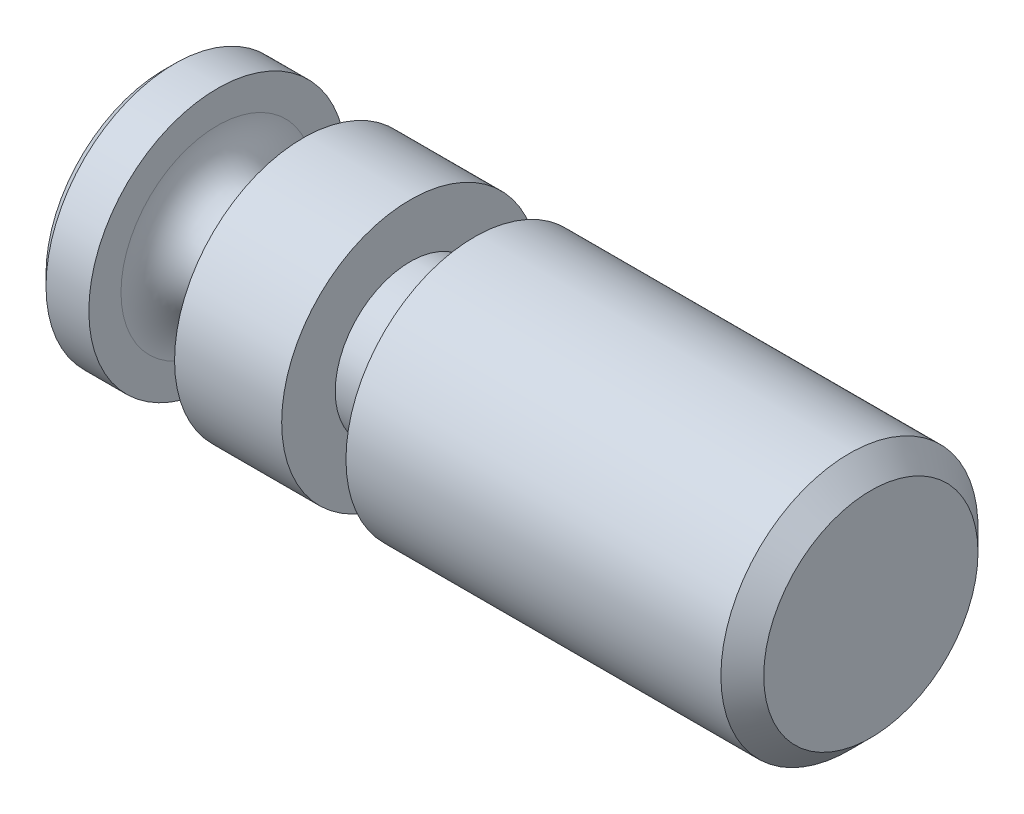
ISO-10303-21;
HEADER;
FILE_DESCRIPTION(('STEP AP214'),'2;1');
FILE_NAME('part.step','',(''),(''),'','','');
FILE_SCHEMA(('AUTOMOTIVE_DESIGN { 1 0 10303 214 1 1 1 1 }'));
ENDSEC;
DATA;
#1=APPLICATION_CONTEXT('core data for automotive mechanical design processes');
#2=APPLICATION_PROTOCOL_DEFINITION('international standard','automotive_design',2000,#1);
#3=PRODUCT_CONTEXT('',#1,'mechanical');
#4=PRODUCT('Part','Part','',(#3));
#5=PRODUCT_RELATED_PRODUCT_CATEGORY('part','',(#4));
#6=PRODUCT_DEFINITION_FORMATION('','',#4);
#7=PRODUCT_DEFINITION_CONTEXT('part definition',#1,'design');
#8=PRODUCT_DEFINITION('design','',#6,#7);
#9=PRODUCT_DEFINITION_SHAPE('','',#8);
#10=(LENGTH_UNIT() NAMED_UNIT(*) SI_UNIT(.MILLI.,.METRE.));
#11=(NAMED_UNIT(*) PLANE_ANGLE_UNIT() SI_UNIT($,.RADIAN.));
#12=(NAMED_UNIT(*) SI_UNIT($,.STERADIAN.) SOLID_ANGLE_UNIT());
#13=UNCERTAINTY_MEASURE_WITH_UNIT(LENGTH_MEASURE(1.E-05),#10,'distance_accuracy_value','');
#14=(GEOMETRIC_REPRESENTATION_CONTEXT(3) GLOBAL_UNCERTAINTY_ASSIGNED_CONTEXT((#13)) GLOBAL_UNIT_ASSIGNED_CONTEXT((#10,
#11,#12)) REPRESENTATION_CONTEXT('',''));
#15=CARTESIAN_POINT('',(0.,0.,0.));
#16=DIRECTION('',(0.,0.,1.));
#17=DIRECTION('',(1.,0.,0.));
#18=AXIS2_PLACEMENT_3D('',#15,#16,#17);
#19=CARTESIAN_POINT('',(0.,6.,0.));
#20=DIRECTION('',(-1.,0.,0.));
#21=DIRECTION('',(0.,0.,1.));
#22=AXIS2_PLACEMENT_3D('',#19,#20,#21);
#23=CONICAL_SURFACE('',#22,6.,0.785398163397444);
#24=CARTESIAN_POINT('',(1.,6.,0.));
#25=DIRECTION('',(-1.,0.,0.));
#26=DIRECTION('',(0.,0.,1.));
#27=AXIS2_PLACEMENT_3D('',#24,#25,#26);
#28=CIRCLE('',#27,5.00000000000001);
#29=CARTESIAN_POINT('',(1.,6.,5.00000000000001));
#30=VERTEX_POINT('',#29);
#31=EDGE_CURVE('E10',#30,#30,#28,.T.);
#32=ORIENTED_EDGE('',*,*,#31,.T.);
#33=EDGE_LOOP('',(#32));
#34=FACE_BOUND('',#33,.T.);
#35=CARTESIAN_POINT('',(0.,6.,0.));
#36=DIRECTION('',(-1.,0.,0.));
#37=DIRECTION('',(0.,0.,1.));
#38=AXIS2_PLACEMENT_3D('',#35,#36,#37);
#39=CIRCLE('',#38,6.);
#40=CARTESIAN_POINT('',(0.,6.,6.));
#41=VERTEX_POINT('',#40);
#42=EDGE_CURVE('E92',#41,#41,#39,.T.);
#43=ORIENTED_EDGE('',*,*,#42,.F.);
#44=EDGE_LOOP('',(#43));
#45=FACE_BOUND('',#44,.T.);
#46=ADVANCED_FACE('F41',(#34,#45),#23,.T.);
#47=CARTESIAN_POINT('',(1.,6.,0.));
#48=DIRECTION('',(1.,0.,0.));
#49=DIRECTION('',(0.,0.,-1.));
#50=AXIS2_PLACEMENT_3D('',#47,#48,#49);
#51=PLANE('',#50);
#52=ORIENTED_EDGE('',*,*,#31,.F.);
#53=EDGE_LOOP('',(#52));
#54=FACE_BOUND('',#53,.T.);
#55=ADVANCED_FACE('F101',(#54),#51,.T.);
#56=CARTESIAN_POINT('',(-32.,6.,0.));
#57=DIRECTION('',(-1.,0.,0.));
#58=DIRECTION('',(0.,0.,1.));
#59=AXIS2_PLACEMENT_3D('',#56,#57,#58);
#60=PLANE('',#59);
#61=CARTESIAN_POINT('',(-32.,6.,0.));
#62=DIRECTION('',(-1.,0.,0.));
#63=DIRECTION('',(0.,0.,1.));
#64=AXIS2_PLACEMENT_3D('',#61,#62,#63);
#65=CIRCLE('',#64,5.50000000000002);
#66=CARTESIAN_POINT('',(-32.,6.,5.50000000000002));
#67=VERTEX_POINT('',#66);
#68=EDGE_CURVE('E48',#67,#67,#65,.T.);
#69=ORIENTED_EDGE('',*,*,#68,.T.);
#70=EDGE_LOOP('',(#69));
#71=FACE_BOUND('',#70,.T.);
#72=ADVANCED_FACE('F105',(#71),#60,.T.);
#73=CARTESIAN_POINT('',(-32.,6.,0.));
#74=DIRECTION('',(1.,0.,0.));
#75=DIRECTION('',(0.,0.,-1.));
#76=AXIS2_PLACEMENT_3D('',#73,#74,#75);
#77=CONICAL_SURFACE('',#76,5.50000000000002,0.785398163397425);
#78=CARTESIAN_POINT('',(-31.5,6.,0.));
#79=DIRECTION('',(-1.,0.,0.));
#80=DIRECTION('',(0.,0.,1.));
#81=AXIS2_PLACEMENT_3D('',#78,#79,#80);
#82=CIRCLE('',#81,6.);
#83=CARTESIAN_POINT('',(-31.5,6.,6.));
#84=VERTEX_POINT('',#83);
#85=EDGE_CURVE('E53',#84,#84,#82,.T.);
#86=ORIENTED_EDGE('',*,*,#85,.T.);
#87=EDGE_LOOP('',(#86));
#88=FACE_BOUND('',#87,.T.);
#89=ORIENTED_EDGE('',*,*,#68,.F.);
#90=EDGE_LOOP('',(#89));
#91=FACE_BOUND('',#90,.T.);
#92=ADVANCED_FACE('F110',(#88,#91),#77,.T.);
#93=CARTESIAN_POINT('',(-32.,6.,0.));
#94=DIRECTION('',(-1.,0.,0.));
#95=DIRECTION('',(0.,0.,1.));
#96=AXIS2_PLACEMENT_3D('',#93,#94,#95);
#97=CYLINDRICAL_SURFACE('',#96,6.);
#98=CARTESIAN_POINT('',(-29.5,6.,0.));
#99=DIRECTION('',(-1.,0.,0.));
#100=DIRECTION('',(0.,0.,1.));
#101=AXIS2_PLACEMENT_3D('',#98,#99,#100);
#102=CIRCLE('',#101,6.);
#103=CARTESIAN_POINT('',(-29.5,6.,6.));
#104=VERTEX_POINT('',#103);
#105=EDGE_CURVE('E58',#104,#104,#102,.T.);
#106=ORIENTED_EDGE('',*,*,#105,.T.);
#107=EDGE_LOOP('',(#106));
#108=FACE_BOUND('',#107,.T.);
#109=ORIENTED_EDGE('',*,*,#85,.F.);
#110=EDGE_LOOP('',(#109));
#111=FACE_BOUND('',#110,.T.);
#112=ADVANCED_FACE('F115',(#108,#111),#97,.T.);
#113=CARTESIAN_POINT('',(-29.5,0.,0.));
#114=DIRECTION('',(1.,0.,0.));
#115=DIRECTION('',(0.,0.,-1.));
#116=AXIS2_PLACEMENT_3D('',#113,#114,#115);
#117=PLANE('',#116);
#118=CARTESIAN_POINT('',(-29.5,6.,0.));
#119=DIRECTION('',(-1.,0.,0.));
#120=DIRECTION('',(0.,0.,1.));
#121=AXIS2_PLACEMENT_3D('',#118,#119,#120);
#122=CIRCLE('',#121,4.5);
#123=CARTESIAN_POINT('',(-29.5,6.,4.5));
#124=VERTEX_POINT('',#123);
#125=EDGE_CURVE('E64',#124,#124,#122,.T.);
#126=ORIENTED_EDGE('',*,*,#125,.T.);
#127=EDGE_LOOP('',(#126));
#128=FACE_BOUND('',#127,.T.);
#129=ORIENTED_EDGE('',*,*,#105,.F.);
#130=EDGE_LOOP('',(#129));
#131=FACE_BOUND('',#130,.T.);
#132=ADVANCED_FACE('F119',(#128,#131),#117,.T.);
#133=CARTESIAN_POINT('',(-27.5,6.,0.));
#134=DIRECTION('',(-1.,0.,0.));
#135=DIRECTION('',(0.,0.,1.));
#136=AXIS2_PLACEMENT_3D('',#133,#134,#135);
#137=TOROIDAL_SURFACE('',#136,4.5,2.);
#138=CARTESIAN_POINT('',(-25.5,6.,0.));
#139=DIRECTION('',(-1.,0.,0.));
#140=DIRECTION('',(0.,0.,1.));
#141=AXIS2_PLACEMENT_3D('',#138,#139,#140);
#142=CIRCLE('',#141,4.5);
#143=CARTESIAN_POINT('',(-25.5,6.,4.5));
#144=VERTEX_POINT('',#143);
#145=EDGE_CURVE('E68',#144,#144,#142,.T.);
#146=ORIENTED_EDGE('',*,*,#145,.T.);
#147=EDGE_LOOP('',(#146));
#148=FACE_BOUND('',#147,.T.);
#149=ORIENTED_EDGE('',*,*,#125,.F.);
#150=EDGE_LOOP('',(#149));
#151=FACE_BOUND('',#150,.T.);
#152=ADVANCED_FACE('F123',(#148,#151),#137,.F.);
#153=CARTESIAN_POINT('',(-25.5,1.5,0.));
#154=DIRECTION('',(-1.,0.,0.));
#155=DIRECTION('',(0.,0.,1.));
#156=AXIS2_PLACEMENT_3D('',#153,#154,#155);
#157=PLANE('',#156);
#158=CARTESIAN_POINT('',(-25.5,6.,0.));
#159=DIRECTION('',(-1.,0.,0.));
#160=DIRECTION('',(0.,0.,1.));
#161=AXIS2_PLACEMENT_3D('',#158,#159,#160);
#162=CIRCLE('',#161,6.);
#163=CARTESIAN_POINT('',(-25.5,6.,6.));
#164=VERTEX_POINT('',#163);
#165=EDGE_CURVE('E72',#164,#164,#162,.T.);
#166=ORIENTED_EDGE('',*,*,#165,.T.);
#167=EDGE_LOOP('',(#166));
#168=FACE_BOUND('',#167,.T.);
#169=ORIENTED_EDGE('',*,*,#145,.F.);
#170=EDGE_LOOP('',(#169));
#171=FACE_BOUND('',#170,.T.);
#172=ADVANCED_FACE('F127',(#168,#171),#157,.T.);
#173=CARTESIAN_POINT('',(-32.,6.,0.));
#174=DIRECTION('',(-1.,0.,0.));
#175=DIRECTION('',(0.,0.,1.));
#176=AXIS2_PLACEMENT_3D('',#173,#174,#175);
#177=CYLINDRICAL_SURFACE('',#176,6.);
#178=CARTESIAN_POINT('',(-20.5,6.,0.));
#179=DIRECTION('',(-1.,0.,0.));
#180=DIRECTION('',(0.,0.,1.));
#181=AXIS2_PLACEMENT_3D('',#178,#179,#180);
#182=CIRCLE('',#181,6.);
#183=CARTESIAN_POINT('',(-20.5,6.,6.));
#184=VERTEX_POINT('',#183);
#185=EDGE_CURVE('E76',#184,#184,#182,.T.);
#186=ORIENTED_EDGE('',*,*,#185,.T.);
#187=EDGE_LOOP('',(#186));
#188=FACE_BOUND('',#187,.T.);
#189=ORIENTED_EDGE('',*,*,#165,.F.);
#190=EDGE_LOOP('',(#189));
#191=FACE_BOUND('',#190,.T.);
#192=ADVANCED_FACE('F131',(#188,#191),#177,.T.);
#193=CARTESIAN_POINT('',(-20.5,0.,0.));
#194=DIRECTION('',(1.,0.,0.));
#195=DIRECTION('',(0.,0.,-1.));
#196=AXIS2_PLACEMENT_3D('',#193,#194,#195);
#197=PLANE('',#196);
#198=CARTESIAN_POINT('',(-20.5,6.,0.));
#199=DIRECTION('',(-1.,0.,0.));
#200=DIRECTION('',(0.,0.,1.));
#201=AXIS2_PLACEMENT_3D('',#198,#199,#200);
#202=CIRCLE('',#201,3.5);
#203=CARTESIAN_POINT('',(-20.5,6.,3.5));
#204=VERTEX_POINT('',#203);
#205=EDGE_CURVE('E80',#204,#204,#202,.T.);
#206=ORIENTED_EDGE('',*,*,#205,.T.);
#207=EDGE_LOOP('',(#206));
#208=FACE_BOUND('',#207,.T.);
#209=ORIENTED_EDGE('',*,*,#185,.F.);
#210=EDGE_LOOP('',(#209));
#211=FACE_BOUND('',#210,.T.);
#212=ADVANCED_FACE('F135',(#208,#211),#197,.T.);
#213=CARTESIAN_POINT('',(-32.,6.,0.));
#214=DIRECTION('',(-1.,0.,0.));
#215=DIRECTION('',(0.,0.,1.));
#216=AXIS2_PLACEMENT_3D('',#213,#214,#215);
#217=CYLINDRICAL_SURFACE('',#216,3.5);
#218=CARTESIAN_POINT('',(-17.5,6.,0.));
#219=DIRECTION('',(-1.,0.,0.));
#220=DIRECTION('',(0.,0.,1.));
#221=AXIS2_PLACEMENT_3D('',#218,#219,#220);
#222=CIRCLE('',#221,3.5);
#223=CARTESIAN_POINT('',(-17.5,6.,3.5));
#224=VERTEX_POINT('',#223);
#225=EDGE_CURVE('E84',#224,#224,#222,.T.);
#226=ORIENTED_EDGE('',*,*,#225,.T.);
#227=EDGE_LOOP('',(#226));
#228=FACE_BOUND('',#227,.T.);
#229=ORIENTED_EDGE('',*,*,#205,.F.);
#230=EDGE_LOOP('',(#229));
#231=FACE_BOUND('',#230,.T.);
#232=ADVANCED_FACE('F139',(#228,#231),#217,.T.);
#233=CARTESIAN_POINT('',(-17.5,0.,0.));
#234=DIRECTION('',(-1.,0.,0.));
#235=DIRECTION('',(0.,0.,1.));
#236=AXIS2_PLACEMENT_3D('',#233,#234,#235);
#237=PLANE('',#236);
#238=CARTESIAN_POINT('',(-17.5,6.,0.));
#239=DIRECTION('',(-1.,0.,0.));
#240=DIRECTION('',(0.,0.,1.));
#241=AXIS2_PLACEMENT_3D('',#238,#239,#240);
#242=CIRCLE('',#241,6.);
#243=CARTESIAN_POINT('',(-17.5,6.,6.));
#244=VERTEX_POINT('',#243);
#245=EDGE_CURVE('E88',#244,#244,#242,.T.);
#246=ORIENTED_EDGE('',*,*,#245,.T.);
#247=EDGE_LOOP('',(#246));
#248=FACE_BOUND('',#247,.T.);
#249=ORIENTED_EDGE('',*,*,#225,.F.);
#250=EDGE_LOOP('',(#249));
#251=FACE_BOUND('',#250,.T.);
#252=ADVANCED_FACE('F143',(#248,#251),#237,.T.);
#253=CARTESIAN_POINT('',(-32.,6.,0.));
#254=DIRECTION('',(-1.,0.,0.));
#255=DIRECTION('',(0.,0.,1.));
#256=AXIS2_PLACEMENT_3D('',#253,#254,#255);
#257=CYLINDRICAL_SURFACE('',#256,6.);
#258=ORIENTED_EDGE('',*,*,#42,.T.);
#259=EDGE_LOOP('',(#258));
#260=FACE_BOUND('',#259,.T.);
#261=ORIENTED_EDGE('',*,*,#245,.F.);
#262=EDGE_LOOP('',(#261));
#263=FACE_BOUND('',#262,.T.);
#264=ADVANCED_FACE('F97',(#260,#263),#257,.T.);
#265=CLOSED_SHELL('',(#46,#55,#72,#92,#112,#132,#152,#172,#192,#212,#232,#252,#264));
#266=MANIFOLD_SOLID_BREP('B2',#265);
#267=ADVANCED_BREP_SHAPE_REPRESENTATION('',(#18,#266),#14);
#268=SHAPE_DEFINITION_REPRESENTATION(#9,#267);
ENDSEC;
END-ISO-10303-21;
